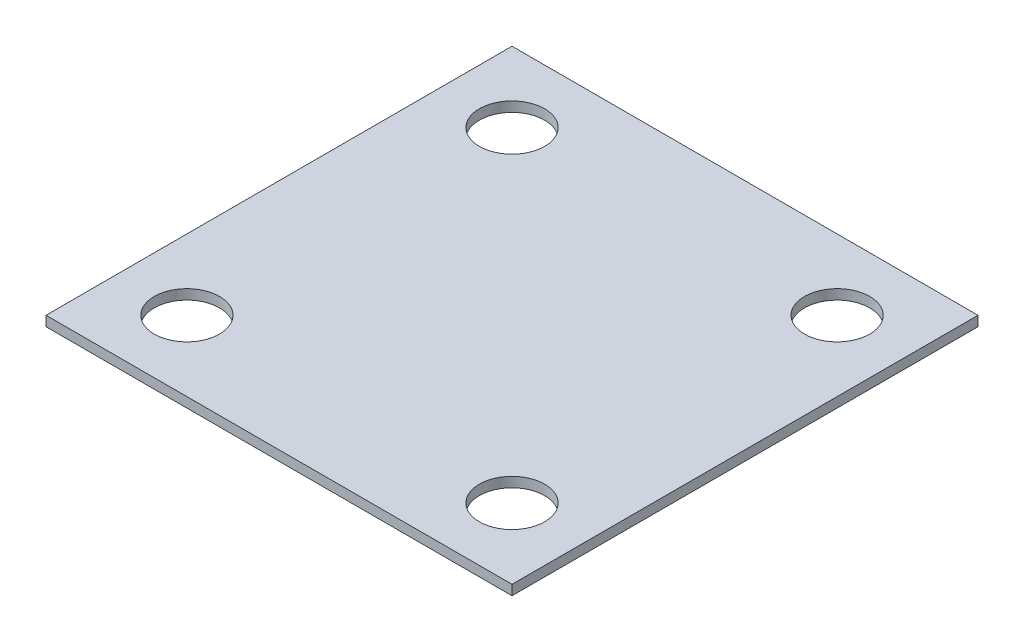
ISO-10303-21;
HEADER;
FILE_DESCRIPTION(('STEP AP214'),'2;1');
FILE_NAME('part.step','',(''),(''),'','','');
FILE_SCHEMA(('AUTOMOTIVE_DESIGN { 1 0 10303 214 1 1 1 1 }'));
ENDSEC;
DATA;
#1=APPLICATION_CONTEXT('core data for automotive mechanical design processes');
#2=APPLICATION_PROTOCOL_DEFINITION('international standard','automotive_design',2000,#1);
#3=PRODUCT_CONTEXT('',#1,'mechanical');
#4=PRODUCT('Part','Part','',(#3));
#5=PRODUCT_RELATED_PRODUCT_CATEGORY('part','',(#4));
#6=PRODUCT_DEFINITION_FORMATION('','',#4);
#7=PRODUCT_DEFINITION_CONTEXT('part definition',#1,'design');
#8=PRODUCT_DEFINITION('design','',#6,#7);
#9=PRODUCT_DEFINITION_SHAPE('','',#8);
#10=(LENGTH_UNIT() NAMED_UNIT(*) SI_UNIT(.MILLI.,.METRE.));
#11=(NAMED_UNIT(*) PLANE_ANGLE_UNIT() SI_UNIT($,.RADIAN.));
#12=(NAMED_UNIT(*) SI_UNIT($,.STERADIAN.) SOLID_ANGLE_UNIT());
#13=UNCERTAINTY_MEASURE_WITH_UNIT(LENGTH_MEASURE(1.E-05),#10,'distance_accuracy_value','');
#14=(GEOMETRIC_REPRESENTATION_CONTEXT(3) GLOBAL_UNCERTAINTY_ASSIGNED_CONTEXT((#13)) GLOBAL_UNIT_ASSIGNED_CONTEXT((#10,
#11,#12)) REPRESENTATION_CONTEXT('',''));
#15=CARTESIAN_POINT('',(0.,0.,0.));
#16=DIRECTION('',(0.,0.,1.));
#17=DIRECTION('',(1.,0.,0.));
#18=AXIS2_PLACEMENT_3D('',#15,#16,#17);
#19=CARTESIAN_POINT('',(0.,1.6,0.));
#20=DIRECTION('',(0.,-1.,0.));
#21=DIRECTION('',(0.,0.,-1.));
#22=AXIS2_PLACEMENT_3D('',#19,#20,#21);
#23=PLANE('',#22);
#24=DIRECTION('',(0.,0.,-1.));
#25=VECTOR('',#24,1.);
#26=CARTESIAN_POINT('',(37.5,1.6,37.5));
#27=LINE('',#26,#25);
#28=CARTESIAN_POINT('',(37.5,1.6,37.5));
#29=VERTEX_POINT('',#28);
#30=CARTESIAN_POINT('',(37.5,1.6,-37.5));
#31=VERTEX_POINT('',#30);
#32=EDGE_CURVE('E92',#29,#31,#27,.T.);
#33=ORIENTED_EDGE('',*,*,#32,.T.);
#34=DIRECTION('',(-1.,0.,0.));
#35=VECTOR('',#34,1.);
#36=CARTESIAN_POINT('',(-37.5,1.6,-37.5));
#37=LINE('',#36,#35);
#38=CARTESIAN_POINT('',(-37.5,1.6,-37.5));
#39=VERTEX_POINT('',#38);
#40=EDGE_CURVE('E87',#31,#39,#37,.T.);
#41=ORIENTED_EDGE('',*,*,#40,.T.);
#42=DIRECTION('',(0.,0.,1.));
#43=VECTOR('',#42,1.);
#44=CARTESIAN_POINT('',(-37.5,1.6,37.5));
#45=LINE('',#44,#43);
#46=CARTESIAN_POINT('',(-37.5,1.6,37.5));
#47=VERTEX_POINT('',#46);
#48=EDGE_CURVE('E90',#39,#47,#45,.T.);
#49=ORIENTED_EDGE('',*,*,#48,.T.);
#50=DIRECTION('',(1.,0.,0.));
#51=VECTOR('',#50,1.);
#52=CARTESIAN_POINT('',(-37.5,1.6,37.5));
#53=LINE('',#52,#51);
#54=EDGE_CURVE('E57',#47,#29,#53,.T.);
#55=ORIENTED_EDGE('',*,*,#54,.T.);
#56=EDGE_LOOP('',(#33,#41,#49,#55));
#57=FACE_BOUND('',#56,.T.);
#58=CARTESIAN_POINT('',(-26.1629,1.6,26.1629));
#59=DIRECTION('',(0.,1.,0.));
#60=DIRECTION('',(0.,0.,1.));
#61=AXIS2_PLACEMENT_3D('',#58,#59,#60);
#62=CIRCLE('',#61,5.25);
#63=CARTESIAN_POINT('',(-26.1629,1.6,31.4129));
#64=VERTEX_POINT('',#63);
#65=EDGE_CURVE('E112',#64,#64,#62,.T.);
#66=ORIENTED_EDGE('',*,*,#65,.F.);
#67=EDGE_LOOP('',(#66));
#68=FACE_BOUND('',#67,.T.);
#69=CARTESIAN_POINT('',(26.163103615411,1.6,26.1629));
#70=DIRECTION('',(0.,1.,0.));
#71=DIRECTION('',(0.,0.,1.));
#72=AXIS2_PLACEMENT_3D('',#69,#70,#71);
#73=CIRCLE('',#72,5.25);
#74=CARTESIAN_POINT('',(26.163103615411,1.6,31.4129));
#75=VERTEX_POINT('',#74);
#76=EDGE_CURVE('E134',#75,#75,#73,.T.);
#77=ORIENTED_EDGE('',*,*,#76,.F.);
#78=EDGE_LOOP('',(#77));
#79=FACE_BOUND('',#78,.T.);
#80=CARTESIAN_POINT('',(-26.1629,1.6,-26.1629));
#81=DIRECTION('',(0.,1.,0.));
#82=DIRECTION('',(0.,0.,1.));
#83=AXIS2_PLACEMENT_3D('',#80,#81,#82);
#84=CIRCLE('',#83,5.25);
#85=CARTESIAN_POINT('',(-26.1629,1.6,-20.9129));
#86=VERTEX_POINT('',#85);
#87=EDGE_CURVE('E142',#86,#86,#84,.T.);
#88=ORIENTED_EDGE('',*,*,#87,.F.);
#89=EDGE_LOOP('',(#88));
#90=FACE_BOUND('',#89,.T.);
#91=CARTESIAN_POINT('',(26.163103615411,1.6,-26.1629));
#92=DIRECTION('',(0.,1.,0.));
#93=DIRECTION('',(0.,0.,1.));
#94=AXIS2_PLACEMENT_3D('',#91,#92,#93);
#95=CIRCLE('',#94,5.25);
#96=CARTESIAN_POINT('',(26.163103615411,1.6,-20.9129));
#97=VERTEX_POINT('',#96);
#98=EDGE_CURVE('E150',#97,#97,#95,.T.);
#99=ORIENTED_EDGE('',*,*,#98,.F.);
#100=EDGE_LOOP('',(#99));
#101=FACE_BOUND('',#100,.T.);
#102=ADVANCED_FACE('F39',(#57,#68,#79,#90,#101),#23,.F.);
#103=CARTESIAN_POINT('',(0.,0.,0.));
#104=DIRECTION('',(0.,-1.,0.));
#105=DIRECTION('',(0.,0.,-1.));
#106=AXIS2_PLACEMENT_3D('',#103,#104,#105);
#107=PLANE('',#106);
#108=CARTESIAN_POINT('',(-26.1629,0.,-26.1629));
#109=DIRECTION('',(0.,1.,0.));
#110=DIRECTION('',(0.,0.,1.));
#111=AXIS2_PLACEMENT_3D('',#108,#109,#110);
#112=CIRCLE('',#111,5.25);
#113=CARTESIAN_POINT('',(-26.1629,0.,-20.9129));
#114=VERTEX_POINT('',#113);
#115=EDGE_CURVE('E146',#114,#114,#112,.T.);
#116=ORIENTED_EDGE('',*,*,#115,.T.);
#117=EDGE_LOOP('',(#116));
#118=FACE_BOUND('',#117,.T.);
#119=CARTESIAN_POINT('',(-26.1629,0.,26.1629));
#120=DIRECTION('',(0.,1.,0.));
#121=DIRECTION('',(0.,0.,1.));
#122=AXIS2_PLACEMENT_3D('',#119,#120,#121);
#123=CIRCLE('',#122,5.25);
#124=CARTESIAN_POINT('',(-26.1629,0.,31.4129));
#125=VERTEX_POINT('',#124);
#126=EDGE_CURVE('E130',#125,#125,#123,.T.);
#127=ORIENTED_EDGE('',*,*,#126,.T.);
#128=EDGE_LOOP('',(#127));
#129=FACE_BOUND('',#128,.T.);
#130=DIRECTION('',(0.,0.,-1.));
#131=VECTOR('',#130,1.);
#132=CARTESIAN_POINT('',(37.5,0.,37.5));
#133=LINE('',#132,#131);
#134=CARTESIAN_POINT('',(37.5,0.,37.5));
#135=VERTEX_POINT('',#134);
#136=CARTESIAN_POINT('',(37.5,0.,-37.5));
#137=VERTEX_POINT('',#136);
#138=EDGE_CURVE('E108',#135,#137,#133,.T.);
#139=ORIENTED_EDGE('',*,*,#138,.F.);
#140=DIRECTION('',(1.,0.,0.));
#141=VECTOR('',#140,1.);
#142=CARTESIAN_POINT('',(-37.5,0.,37.5));
#143=LINE('',#142,#141);
#144=CARTESIAN_POINT('',(-37.5,0.,37.5));
#145=VERTEX_POINT('',#144);
#146=EDGE_CURVE('E80',#145,#135,#143,.T.);
#147=ORIENTED_EDGE('',*,*,#146,.F.);
#148=DIRECTION('',(0.,0.,1.));
#149=VECTOR('',#148,1.);
#150=CARTESIAN_POINT('',(-37.5,0.,37.5));
#151=LINE('',#150,#149);
#152=CARTESIAN_POINT('',(-37.5,0.,-37.5));
#153=VERTEX_POINT('',#152);
#154=EDGE_CURVE('E74',#153,#145,#151,.T.);
#155=ORIENTED_EDGE('',*,*,#154,.F.);
#156=DIRECTION('',(-1.,0.,0.));
#157=VECTOR('',#156,1.);
#158=CARTESIAN_POINT('',(-37.5,0.,-37.5));
#159=LINE('',#158,#157);
#160=EDGE_CURVE('E97',#137,#153,#159,.T.);
#161=ORIENTED_EDGE('',*,*,#160,.F.);
#162=EDGE_LOOP('',(#139,#147,#155,#161));
#163=FACE_BOUND('',#162,.T.);
#164=CARTESIAN_POINT('',(26.163103615411,0.,26.1629));
#165=DIRECTION('',(0.,1.,0.));
#166=DIRECTION('',(0.,0.,1.));
#167=AXIS2_PLACEMENT_3D('',#164,#165,#166);
#168=CIRCLE('',#167,5.25);
#169=CARTESIAN_POINT('',(26.163103615411,0.,31.4129));
#170=VERTEX_POINT('',#169);
#171=EDGE_CURVE('E138',#170,#170,#168,.T.);
#172=ORIENTED_EDGE('',*,*,#171,.T.);
#173=EDGE_LOOP('',(#172));
#174=FACE_BOUND('',#173,.T.);
#175=CARTESIAN_POINT('',(26.163103615411,0.,-26.1629));
#176=DIRECTION('',(0.,1.,0.));
#177=DIRECTION('',(0.,0.,1.));
#178=AXIS2_PLACEMENT_3D('',#175,#176,#177);
#179=CIRCLE('',#178,5.25);
#180=CARTESIAN_POINT('',(26.163103615411,0.,-20.9129));
#181=VERTEX_POINT('',#180);
#182=EDGE_CURVE('E154',#181,#181,#179,.T.);
#183=ORIENTED_EDGE('',*,*,#182,.T.);
#184=EDGE_LOOP('',(#183));
#185=FACE_BOUND('',#184,.T.);
#186=ADVANCED_FACE('F125',(#118,#129,#163,#174,#185),#107,.T.);
#187=CARTESIAN_POINT('',(37.5,1.6,37.5));
#188=DIRECTION('',(-1.,0.,0.));
#189=DIRECTION('',(0.,0.,1.));
#190=AXIS2_PLACEMENT_3D('',#187,#188,#189);
#191=PLANE('',#190);
#192=ORIENTED_EDGE('',*,*,#138,.T.);
#193=DIRECTION('',(0.,-1.,0.));
#194=VECTOR('',#193,1.);
#195=CARTESIAN_POINT('',(37.5,1.6,-37.5));
#196=LINE('',#195,#194);
#197=EDGE_CURVE('E11',#31,#137,#196,.T.);
#198=ORIENTED_EDGE('',*,*,#197,.F.);
#199=ORIENTED_EDGE('',*,*,#32,.F.);
#200=DIRECTION('',(0.,-1.,0.));
#201=VECTOR('',#200,1.);
#202=CARTESIAN_POINT('',(37.5,1.6,37.5));
#203=LINE('',#202,#201);
#204=EDGE_CURVE('E104',#29,#135,#203,.T.);
#205=ORIENTED_EDGE('',*,*,#204,.T.);
#206=EDGE_LOOP('',(#192,#198,#199,#205));
#207=FACE_BOUND('',#206,.T.);
#208=ADVANCED_FACE('F41',(#207),#191,.F.);
#209=CARTESIAN_POINT('',(-37.5,1.6,-37.5));
#210=DIRECTION('',(0.,0.,1.));
#211=DIRECTION('',(1.,0.,0.));
#212=AXIS2_PLACEMENT_3D('',#209,#210,#211);
#213=PLANE('',#212);
#214=ORIENTED_EDGE('',*,*,#160,.T.);
#215=DIRECTION('',(0.,-1.,0.));
#216=VECTOR('',#215,1.);
#217=CARTESIAN_POINT('',(-37.5,1.6,-37.5));
#218=LINE('',#217,#216);
#219=EDGE_CURVE('E49',#39,#153,#218,.T.);
#220=ORIENTED_EDGE('',*,*,#219,.F.);
#221=ORIENTED_EDGE('',*,*,#40,.F.);
#222=ORIENTED_EDGE('',*,*,#197,.T.);
#223=EDGE_LOOP('',(#214,#220,#221,#222));
#224=FACE_BOUND('',#223,.T.);
#225=ADVANCED_FACE('F96',(#224),#213,.F.);
#226=CARTESIAN_POINT('',(-37.5,1.6,37.5));
#227=DIRECTION('',(1.,0.,0.));
#228=DIRECTION('',(0.,0.,-1.));
#229=AXIS2_PLACEMENT_3D('',#226,#227,#228);
#230=PLANE('',#229);
#231=ORIENTED_EDGE('',*,*,#154,.T.);
#232=DIRECTION('',(0.,-1.,0.));
#233=VECTOR('',#232,1.);
#234=CARTESIAN_POINT('',(-37.5,1.6,37.5));
#235=LINE('',#234,#233);
#236=EDGE_CURVE('E99',#47,#145,#235,.T.);
#237=ORIENTED_EDGE('',*,*,#236,.F.);
#238=ORIENTED_EDGE('',*,*,#48,.F.);
#239=ORIENTED_EDGE('',*,*,#219,.T.);
#240=EDGE_LOOP('',(#231,#237,#238,#239));
#241=FACE_BOUND('',#240,.T.);
#242=ADVANCED_FACE('F100',(#241),#230,.F.);
#243=CARTESIAN_POINT('',(-37.5,1.6,37.5));
#244=DIRECTION('',(0.,0.,-1.));
#245=DIRECTION('',(-1.,0.,0.));
#246=AXIS2_PLACEMENT_3D('',#243,#244,#245);
#247=PLANE('',#246);
#248=ORIENTED_EDGE('',*,*,#146,.T.);
#249=ORIENTED_EDGE('',*,*,#204,.F.);
#250=ORIENTED_EDGE('',*,*,#54,.F.);
#251=ORIENTED_EDGE('',*,*,#236,.T.);
#252=EDGE_LOOP('',(#248,#249,#250,#251));
#253=FACE_BOUND('',#252,.T.);
#254=ADVANCED_FACE('F122',(#253),#247,.F.);
#255=CARTESIAN_POINT('',(-26.1629,1.6,26.1629));
#256=DIRECTION('',(0.,-1.,0.));
#257=DIRECTION('',(0.,0.,-1.));
#258=AXIS2_PLACEMENT_3D('',#255,#256,#257);
#259=CYLINDRICAL_SURFACE('',#258,5.25);
#260=ORIENTED_EDGE('',*,*,#65,.T.);
#261=EDGE_LOOP('',(#260));
#262=FACE_BOUND('',#261,.T.);
#263=ORIENTED_EDGE('',*,*,#126,.F.);
#264=EDGE_LOOP('',(#263));
#265=FACE_BOUND('',#264,.T.);
#266=ADVANCED_FACE('F173',(#262,#265),#259,.F.);
#267=CARTESIAN_POINT('',(26.163103615411,1.6,26.1629));
#268=DIRECTION('',(0.,-1.,0.));
#269=DIRECTION('',(0.,0.,-1.));
#270=AXIS2_PLACEMENT_3D('',#267,#268,#269);
#271=CYLINDRICAL_SURFACE('',#270,5.25);
#272=ORIENTED_EDGE('',*,*,#76,.T.);
#273=EDGE_LOOP('',(#272));
#274=FACE_BOUND('',#273,.T.);
#275=ORIENTED_EDGE('',*,*,#171,.F.);
#276=EDGE_LOOP('',(#275));
#277=FACE_BOUND('',#276,.T.);
#278=ADVANCED_FACE('F219',(#274,#277),#271,.F.);
#279=CARTESIAN_POINT('',(-26.1629,1.6,-26.1629));
#280=DIRECTION('',(0.,-1.,0.));
#281=DIRECTION('',(0.,0.,-1.));
#282=AXIS2_PLACEMENT_3D('',#279,#280,#281);
#283=CYLINDRICAL_SURFACE('',#282,5.25);
#284=ORIENTED_EDGE('',*,*,#87,.T.);
#285=EDGE_LOOP('',(#284));
#286=FACE_BOUND('',#285,.T.);
#287=ORIENTED_EDGE('',*,*,#115,.F.);
#288=EDGE_LOOP('',(#287));
#289=FACE_BOUND('',#288,.T.);
#290=ADVANCED_FACE('F227',(#286,#289),#283,.F.);
#291=CARTESIAN_POINT('',(26.163103615411,1.6,-26.1629));
#292=DIRECTION('',(0.,-1.,0.));
#293=DIRECTION('',(0.,0.,-1.));
#294=AXIS2_PLACEMENT_3D('',#291,#292,#293);
#295=CYLINDRICAL_SURFACE('',#294,5.25);
#296=ORIENTED_EDGE('',*,*,#98,.T.);
#297=EDGE_LOOP('',(#296));
#298=FACE_BOUND('',#297,.T.);
#299=ORIENTED_EDGE('',*,*,#182,.F.);
#300=EDGE_LOOP('',(#299));
#301=FACE_BOUND('',#300,.T.);
#302=ADVANCED_FACE('F162',(#298,#301),#295,.F.);
#303=CLOSED_SHELL('',(#102,#186,#208,#225,#242,#254,#266,#278,#290,#302));
#304=MANIFOLD_SOLID_BREP('B2',#303);
#305=ADVANCED_BREP_SHAPE_REPRESENTATION('',(#18,#304),#14);
#306=SHAPE_DEFINITION_REPRESENTATION(#9,#305);
ENDSEC;
END-ISO-10303-21;
